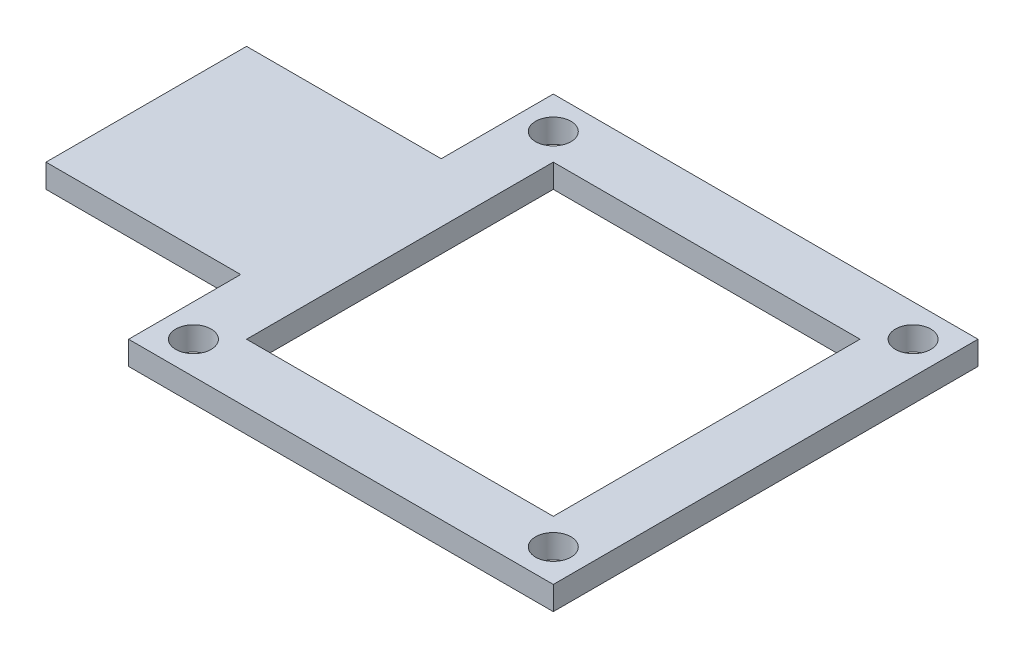
ISO-10303-21;
HEADER;
FILE_DESCRIPTION(('STEP AP214'),'2;1');
FILE_NAME('part.step','',(''),(''),'','','');
FILE_SCHEMA(('AUTOMOTIVE_DESIGN { 1 0 10303 214 1 1 1 1 }'));
ENDSEC;
DATA;
#1=APPLICATION_CONTEXT('core data for automotive mechanical design processes');
#2=APPLICATION_PROTOCOL_DEFINITION('international standard','automotive_design',2000,#1);
#3=PRODUCT_CONTEXT('',#1,'mechanical');
#4=PRODUCT('Part','Part','',(#3));
#5=PRODUCT_RELATED_PRODUCT_CATEGORY('part','',(#4));
#6=PRODUCT_DEFINITION_FORMATION('','',#4);
#7=PRODUCT_DEFINITION_CONTEXT('part definition',#1,'design');
#8=PRODUCT_DEFINITION('design','',#6,#7);
#9=PRODUCT_DEFINITION_SHAPE('','',#8);
#10=(LENGTH_UNIT() NAMED_UNIT(*) SI_UNIT(.MILLI.,.METRE.));
#11=(NAMED_UNIT(*) PLANE_ANGLE_UNIT() SI_UNIT($,.RADIAN.));
#12=(NAMED_UNIT(*) SI_UNIT($,.STERADIAN.) SOLID_ANGLE_UNIT());
#13=UNCERTAINTY_MEASURE_WITH_UNIT(LENGTH_MEASURE(1.E-05),#10,'distance_accuracy_value','');
#14=(GEOMETRIC_REPRESENTATION_CONTEXT(3) GLOBAL_UNCERTAINTY_ASSIGNED_CONTEXT((#13)) GLOBAL_UNIT_ASSIGNED_CONTEXT((#10,
#11,#12)) REPRESENTATION_CONTEXT('',''));
#15=CARTESIAN_POINT('',(0.,0.,0.));
#16=DIRECTION('',(0.,0.,1.));
#17=DIRECTION('',(1.,0.,0.));
#18=AXIS2_PLACEMENT_3D('',#15,#16,#17);
#19=CARTESIAN_POINT('',(-13.,2.,0.));
#20=DIRECTION('',(-1.,0.,0.));
#21=DIRECTION('',(0.,0.,1.));
#22=AXIS2_PLACEMENT_3D('',#19,#20,#21);
#23=PLANE('',#22);
#24=DIRECTION('',(0.,0.,-1.));
#25=VECTOR('',#24,1.);
#26=CARTESIAN_POINT('',(-13.,0.,0.));
#27=LINE('',#26,#25);
#28=CARTESIAN_POINT('',(-13.,0.,13.));
#29=VERTEX_POINT('',#28);
#30=CARTESIAN_POINT('',(-13.,0.,-13.));
#31=VERTEX_POINT('',#30);
#32=EDGE_CURVE('E189',#29,#31,#27,.T.);
#33=ORIENTED_EDGE('',*,*,#32,.T.);
#34=DIRECTION('',(0.,-1.,0.));
#35=VECTOR('',#34,1.);
#36=CARTESIAN_POINT('',(-13.,2.,-13.));
#37=LINE('',#36,#35);
#38=CARTESIAN_POINT('',(-13.,2.,-13.));
#39=VERTEX_POINT('',#38);
#40=EDGE_CURVE('E11',#39,#31,#37,.T.);
#41=ORIENTED_EDGE('',*,*,#40,.F.);
#42=DIRECTION('',(0.,0.,-1.));
#43=VECTOR('',#42,1.);
#44=CARTESIAN_POINT('',(-13.,2.,0.));
#45=LINE('',#44,#43);
#46=CARTESIAN_POINT('',(-13.,2.,13.));
#47=VERTEX_POINT('',#46);
#48=EDGE_CURVE('E139',#47,#39,#45,.T.);
#49=ORIENTED_EDGE('',*,*,#48,.F.);
#50=DIRECTION('',(0.,-1.,0.));
#51=VECTOR('',#50,1.);
#52=CARTESIAN_POINT('',(-13.,2.,13.));
#53=LINE('',#52,#51);
#54=EDGE_CURVE('E54',#47,#29,#53,.T.);
#55=ORIENTED_EDGE('',*,*,#54,.T.);
#56=EDGE_LOOP('',(#33,#41,#49,#55));
#57=FACE_BOUND('',#56,.T.);
#58=ADVANCED_FACE('F35',(#57),#23,.F.);
#59=CARTESIAN_POINT('',(0.,2.,-13.));
#60=DIRECTION('',(0.,0.,-1.));
#61=DIRECTION('',(-1.,0.,0.));
#62=AXIS2_PLACEMENT_3D('',#59,#60,#61);
#63=PLANE('',#62);
#64=DIRECTION('',(1.,0.,0.));
#65=VECTOR('',#64,1.);
#66=CARTESIAN_POINT('',(0.,0.,-13.));
#67=LINE('',#66,#65);
#68=CARTESIAN_POINT('',(13.,0.,-13.));
#69=VERTEX_POINT('',#68);
#70=EDGE_CURVE('E145',#31,#69,#67,.T.);
#71=ORIENTED_EDGE('',*,*,#70,.T.);
#72=DIRECTION('',(0.,-1.,0.));
#73=VECTOR('',#72,1.);
#74=CARTESIAN_POINT('',(13.,2.,-13.));
#75=LINE('',#74,#73);
#76=CARTESIAN_POINT('',(13.,2.,-13.));
#77=VERTEX_POINT('',#76);
#78=EDGE_CURVE('E45',#77,#69,#75,.T.);
#79=ORIENTED_EDGE('',*,*,#78,.F.);
#80=DIRECTION('',(1.,0.,0.));
#81=VECTOR('',#80,1.);
#82=CARTESIAN_POINT('',(0.,2.,-13.));
#83=LINE('',#82,#81);
#84=EDGE_CURVE('E132',#39,#77,#83,.T.);
#85=ORIENTED_EDGE('',*,*,#84,.F.);
#86=ORIENTED_EDGE('',*,*,#40,.T.);
#87=EDGE_LOOP('',(#71,#79,#85,#86));
#88=FACE_BOUND('',#87,.T.);
#89=ADVANCED_FACE('F144',(#88),#63,.F.);
#90=CARTESIAN_POINT('',(13.,2.,0.));
#91=DIRECTION('',(-1.,0.,0.));
#92=DIRECTION('',(0.,0.,1.));
#93=AXIS2_PLACEMENT_3D('',#90,#91,#92);
#94=PLANE('',#93);
#95=DIRECTION('',(0.,0.,-1.));
#96=VECTOR('',#95,1.);
#97=CARTESIAN_POINT('',(13.,0.,0.));
#98=LINE('',#97,#96);
#99=CARTESIAN_POINT('',(13.,0.,13.));
#100=VERTEX_POINT('',#99);
#101=EDGE_CURVE('E192',#100,#69,#98,.T.);
#102=ORIENTED_EDGE('',*,*,#101,.F.);
#103=DIRECTION('',(0.,-1.,0.));
#104=VECTOR('',#103,1.);
#105=CARTESIAN_POINT('',(13.,2.,13.));
#106=LINE('',#105,#104);
#107=CARTESIAN_POINT('',(13.,2.,13.));
#108=VERTEX_POINT('',#107);
#109=EDGE_CURVE('E92',#108,#100,#106,.T.);
#110=ORIENTED_EDGE('',*,*,#109,.F.);
#111=DIRECTION('',(0.,0.,-1.));
#112=VECTOR('',#111,1.);
#113=CARTESIAN_POINT('',(13.,2.,0.));
#114=LINE('',#113,#112);
#115=EDGE_CURVE('E138',#108,#77,#114,.T.);
#116=ORIENTED_EDGE('',*,*,#115,.T.);
#117=ORIENTED_EDGE('',*,*,#78,.T.);
#118=EDGE_LOOP('',(#102,#110,#116,#117));
#119=FACE_BOUND('',#118,.T.);
#120=ADVANCED_FACE('F149',(#119),#94,.T.);
#121=CARTESIAN_POINT('',(-18.,2.,0.));
#122=DIRECTION('',(-1.,0.,0.));
#123=DIRECTION('',(0.,0.,1.));
#124=AXIS2_PLACEMENT_3D('',#121,#122,#123);
#125=PLANE('',#124);
#126=DIRECTION('',(0.,0.,-1.));
#127=VECTOR('',#126,1.);
#128=CARTESIAN_POINT('',(-18.,0.,0.));
#129=LINE('',#128,#127);
#130=CARTESIAN_POINT('',(-18.,0.,-8.5));
#131=VERTEX_POINT('',#130);
#132=CARTESIAN_POINT('',(-18.,0.,-18.));
#133=VERTEX_POINT('',#132);
#134=EDGE_CURVE('E168',#131,#133,#129,.T.);
#135=ORIENTED_EDGE('',*,*,#134,.F.);
#136=DIRECTION('',(0.,-1.,0.));
#137=VECTOR('',#136,1.);
#138=CARTESIAN_POINT('',(-18.,2.,-8.5));
#139=LINE('',#138,#137);
#140=CARTESIAN_POINT('',(-18.,2.,-8.5));
#141=VERTEX_POINT('',#140);
#142=EDGE_CURVE('E39',#141,#131,#139,.T.);
#143=ORIENTED_EDGE('',*,*,#142,.F.);
#144=DIRECTION('',(0.,0.,-1.));
#145=VECTOR('',#144,1.);
#146=CARTESIAN_POINT('',(-18.,2.,0.));
#147=LINE('',#146,#145);
#148=CARTESIAN_POINT('',(-18.,2.,-18.));
#149=VERTEX_POINT('',#148);
#150=EDGE_CURVE('E209',#141,#149,#147,.T.);
#151=ORIENTED_EDGE('',*,*,#150,.T.);
#152=DIRECTION('',(0.,-1.,0.));
#153=VECTOR('',#152,1.);
#154=CARTESIAN_POINT('',(-18.,2.,-18.));
#155=LINE('',#154,#153);
#156=EDGE_CURVE('E167',#149,#133,#155,.T.);
#157=ORIENTED_EDGE('',*,*,#156,.T.);
#158=EDGE_LOOP('',(#135,#143,#151,#157));
#159=FACE_BOUND('',#158,.T.);
#160=ADVANCED_FACE('F236',(#159),#125,.T.);
#161=CARTESIAN_POINT('',(0.,2.,-8.5));
#162=DIRECTION('',(0.,0.,1.));
#163=DIRECTION('',(1.,0.,0.));
#164=AXIS2_PLACEMENT_3D('',#161,#162,#163);
#165=PLANE('',#164);
#166=DIRECTION('',(-1.,0.,0.));
#167=VECTOR('',#166,1.);
#168=CARTESIAN_POINT('',(0.,0.,-8.5));
#169=LINE('',#168,#167);
#170=CARTESIAN_POINT('',(-34.5,0.,-8.5));
#171=VERTEX_POINT('',#170);
#172=EDGE_CURVE('E171',#131,#171,#169,.T.);
#173=ORIENTED_EDGE('',*,*,#172,.T.);
#174=DIRECTION('',(0.,-1.,0.));
#175=VECTOR('',#174,1.);
#176=CARTESIAN_POINT('',(-34.5,2.,-8.5));
#177=LINE('',#176,#175);
#178=CARTESIAN_POINT('',(-34.5,2.,-8.5));
#179=VERTEX_POINT('',#178);
#180=EDGE_CURVE('E223',#179,#171,#177,.T.);
#181=ORIENTED_EDGE('',*,*,#180,.F.);
#182=DIRECTION('',(-1.,0.,0.));
#183=VECTOR('',#182,1.);
#184=CARTESIAN_POINT('',(0.,2.,-8.5));
#185=LINE('',#184,#183);
#186=EDGE_CURVE('E230',#141,#179,#185,.T.);
#187=ORIENTED_EDGE('',*,*,#186,.F.);
#188=ORIENTED_EDGE('',*,*,#142,.T.);
#189=EDGE_LOOP('',(#173,#181,#187,#188));
#190=FACE_BOUND('',#189,.T.);
#191=ADVANCED_FACE('F37',(#190),#165,.F.);
#192=CARTESIAN_POINT('',(-34.5,2.,0.));
#193=DIRECTION('',(-1.,0.,0.));
#194=DIRECTION('',(0.,0.,1.));
#195=AXIS2_PLACEMENT_3D('',#192,#193,#194);
#196=PLANE('',#195);
#197=DIRECTION('',(0.,0.,-1.));
#198=VECTOR('',#197,1.);
#199=CARTESIAN_POINT('',(-34.5,0.,0.));
#200=LINE('',#199,#198);
#201=CARTESIAN_POINT('',(-34.5,0.,8.5));
#202=VERTEX_POINT('',#201);
#203=EDGE_CURVE('E175',#202,#171,#200,.T.);
#204=ORIENTED_EDGE('',*,*,#203,.F.);
#205=DIRECTION('',(0.,-1.,0.));
#206=VECTOR('',#205,1.);
#207=CARTESIAN_POINT('',(-34.5,2.,8.5));
#208=LINE('',#207,#206);
#209=CARTESIAN_POINT('',(-34.5,2.,8.5));
#210=VERTEX_POINT('',#209);
#211=EDGE_CURVE('E222',#210,#202,#208,.T.);
#212=ORIENTED_EDGE('',*,*,#211,.F.);
#213=DIRECTION('',(0.,0.,-1.));
#214=VECTOR('',#213,1.);
#215=CARTESIAN_POINT('',(-34.5,2.,0.));
#216=LINE('',#215,#214);
#217=EDGE_CURVE('E325',#210,#179,#216,.T.);
#218=ORIENTED_EDGE('',*,*,#217,.T.);
#219=ORIENTED_EDGE('',*,*,#180,.T.);
#220=EDGE_LOOP('',(#204,#212,#218,#219));
#221=FACE_BOUND('',#220,.T.);
#222=ADVANCED_FACE('F268',(#221),#196,.T.);
#223=CARTESIAN_POINT('',(0.,2.,8.5));
#224=DIRECTION('',(0.,0.,1.));
#225=DIRECTION('',(1.,0.,0.));
#226=AXIS2_PLACEMENT_3D('',#223,#224,#225);
#227=PLANE('',#226);
#228=DIRECTION('',(-1.,0.,0.));
#229=VECTOR('',#228,1.);
#230=CARTESIAN_POINT('',(0.,0.,8.5));
#231=LINE('',#230,#229);
#232=CARTESIAN_POINT('',(-18.,0.,8.5));
#233=VERTEX_POINT('',#232);
#234=EDGE_CURVE('E178',#233,#202,#231,.T.);
#235=ORIENTED_EDGE('',*,*,#234,.F.);
#236=DIRECTION('',(0.,-1.,0.));
#237=VECTOR('',#236,1.);
#238=CARTESIAN_POINT('',(-18.,2.,8.5));
#239=LINE('',#238,#237);
#240=CARTESIAN_POINT('',(-18.,2.,8.5));
#241=VERTEX_POINT('',#240);
#242=EDGE_CURVE('E220',#241,#233,#239,.T.);
#243=ORIENTED_EDGE('',*,*,#242,.F.);
#244=DIRECTION('',(-1.,0.,0.));
#245=VECTOR('',#244,1.);
#246=CARTESIAN_POINT('',(0.,2.,8.5));
#247=LINE('',#246,#245);
#248=EDGE_CURVE('E266',#241,#210,#247,.T.);
#249=ORIENTED_EDGE('',*,*,#248,.T.);
#250=ORIENTED_EDGE('',*,*,#211,.T.);
#251=EDGE_LOOP('',(#235,#243,#249,#250));
#252=FACE_BOUND('',#251,.T.);
#253=ADVANCED_FACE('F263',(#252),#227,.T.);
#254=CARTESIAN_POINT('',(-18.,0.,18.));
#255=VERTEX_POINT('',#254);
#256=EDGE_CURVE('E172',#255,#233,#129,.T.);
#257=ORIENTED_EDGE('',*,*,#256,.F.);
#258=DIRECTION('',(0.,-1.,0.));
#259=VECTOR('',#258,1.);
#260=CARTESIAN_POINT('',(-18.,2.,18.));
#261=LINE('',#260,#259);
#262=CARTESIAN_POINT('',(-18.,2.,18.));
#263=VERTEX_POINT('',#262);
#264=EDGE_CURVE('E218',#263,#255,#261,.T.);
#265=ORIENTED_EDGE('',*,*,#264,.F.);
#266=EDGE_CURVE('E260',#263,#241,#147,.T.);
#267=ORIENTED_EDGE('',*,*,#266,.T.);
#268=ORIENTED_EDGE('',*,*,#242,.T.);
#269=EDGE_LOOP('',(#257,#265,#267,#268));
#270=FACE_BOUND('',#269,.T.);
#271=ADVANCED_FACE('F259',(#270),#125,.T.);
#272=CARTESIAN_POINT('',(0.,2.,18.));
#273=DIRECTION('',(0.,0.,-1.));
#274=DIRECTION('',(-1.,0.,0.));
#275=AXIS2_PLACEMENT_3D('',#272,#273,#274);
#276=PLANE('',#275);
#277=DIRECTION('',(1.,0.,0.));
#278=VECTOR('',#277,1.);
#279=CARTESIAN_POINT('',(0.,0.,18.));
#280=LINE('',#279,#278);
#281=CARTESIAN_POINT('',(18.,0.,18.));
#282=VERTEX_POINT('',#281);
#283=EDGE_CURVE('E181',#255,#282,#280,.T.);
#284=ORIENTED_EDGE('',*,*,#283,.T.);
#285=DIRECTION('',(0.,-1.,0.));
#286=VECTOR('',#285,1.);
#287=CARTESIAN_POINT('',(18.,2.,18.));
#288=LINE('',#287,#286);
#289=CARTESIAN_POINT('',(18.,2.,18.));
#290=VERTEX_POINT('',#289);
#291=EDGE_CURVE('E215',#290,#282,#288,.T.);
#292=ORIENTED_EDGE('',*,*,#291,.F.);
#293=DIRECTION('',(1.,0.,0.));
#294=VECTOR('',#293,1.);
#295=CARTESIAN_POINT('',(0.,2.,18.));
#296=LINE('',#295,#294);
#297=EDGE_CURVE('E255',#263,#290,#296,.T.);
#298=ORIENTED_EDGE('',*,*,#297,.F.);
#299=ORIENTED_EDGE('',*,*,#264,.T.);
#300=EDGE_LOOP('',(#284,#292,#298,#299));
#301=FACE_BOUND('',#300,.T.);
#302=ADVANCED_FACE('F254',(#301),#276,.F.);
#303=CARTESIAN_POINT('',(18.,2.,0.));
#304=DIRECTION('',(-1.,0.,0.));
#305=DIRECTION('',(0.,0.,1.));
#306=AXIS2_PLACEMENT_3D('',#303,#304,#305);
#307=PLANE('',#306);
#308=DIRECTION('',(0.,0.,-1.));
#309=VECTOR('',#308,1.);
#310=CARTESIAN_POINT('',(18.,0.,0.));
#311=LINE('',#310,#309);
#312=CARTESIAN_POINT('',(18.,0.,-18.));
#313=VERTEX_POINT('',#312);
#314=EDGE_CURVE('E183',#282,#313,#311,.T.);
#315=ORIENTED_EDGE('',*,*,#314,.T.);
#316=DIRECTION('',(0.,-1.,0.));
#317=VECTOR('',#316,1.);
#318=CARTESIAN_POINT('',(18.,2.,-18.));
#319=LINE('',#318,#317);
#320=CARTESIAN_POINT('',(18.,2.,-18.));
#321=VERTEX_POINT('',#320);
#322=EDGE_CURVE('E213',#321,#313,#319,.T.);
#323=ORIENTED_EDGE('',*,*,#322,.F.);
#324=DIRECTION('',(0.,0.,-1.));
#325=VECTOR('',#324,1.);
#326=CARTESIAN_POINT('',(18.,2.,0.));
#327=LINE('',#326,#325);
#328=EDGE_CURVE('E251',#290,#321,#327,.T.);
#329=ORIENTED_EDGE('',*,*,#328,.F.);
#330=ORIENTED_EDGE('',*,*,#291,.T.);
#331=EDGE_LOOP('',(#315,#323,#329,#330));
#332=FACE_BOUND('',#331,.T.);
#333=ADVANCED_FACE('F248',(#332),#307,.F.);
#334=CARTESIAN_POINT('',(15.25,2.,15.25));
#335=DIRECTION('',(0.,-1.,0.));
#336=DIRECTION('',(0.,0.,-1.));
#337=AXIS2_PLACEMENT_3D('',#334,#335,#336);
#338=CYLINDRICAL_SURFACE('',#337,1.5);
#339=CARTESIAN_POINT('',(15.25,2.,15.25));
#340=DIRECTION('',(0.,1.,0.));
#341=DIRECTION('',(0.,0.,1.));
#342=AXIS2_PLACEMENT_3D('',#339,#340,#341);
#343=CIRCLE('',#342,1.5);
#344=CARTESIAN_POINT('',(15.25,2.,16.75));
#345=VERTEX_POINT('',#344);
#346=EDGE_CURVE('E161',#345,#345,#343,.T.);
#347=ORIENTED_EDGE('',*,*,#346,.T.);
#348=EDGE_LOOP('',(#347));
#349=FACE_BOUND('',#348,.T.);
#350=CARTESIAN_POINT('',(15.25,0.,15.25));
#351=DIRECTION('',(0.,1.,0.));
#352=DIRECTION('',(0.,0.,1.));
#353=AXIS2_PLACEMENT_3D('',#350,#351,#352);
#354=CIRCLE('',#353,1.5);
#355=CARTESIAN_POINT('',(15.25,0.,16.75));
#356=VERTEX_POINT('',#355);
#357=EDGE_CURVE('E203',#356,#356,#354,.T.);
#358=ORIENTED_EDGE('',*,*,#357,.F.);
#359=EDGE_LOOP('',(#358));
#360=FACE_BOUND('',#359,.T.);
#361=ADVANCED_FACE('F289',(#349,#360),#338,.F.);
#362=CARTESIAN_POINT('',(-15.25,2.,-15.25));
#363=DIRECTION('',(0.,-1.,0.));
#364=DIRECTION('',(0.,0.,-1.));
#365=AXIS2_PLACEMENT_3D('',#362,#363,#364);
#366=CYLINDRICAL_SURFACE('',#365,1.5);
#367=CARTESIAN_POINT('',(-15.25,2.,-15.25));
#368=DIRECTION('',(0.,1.,0.));
#369=DIRECTION('',(0.,0.,1.));
#370=AXIS2_PLACEMENT_3D('',#367,#368,#369);
#371=CIRCLE('',#370,1.5);
#372=CARTESIAN_POINT('',(-15.25,2.,-13.75));
#373=VERTEX_POINT('',#372);
#374=EDGE_CURVE('E158',#373,#373,#371,.T.);
#375=ORIENTED_EDGE('',*,*,#374,.T.);
#376=EDGE_LOOP('',(#375));
#377=FACE_BOUND('',#376,.T.);
#378=CARTESIAN_POINT('',(-15.25,0.,-15.25));
#379=DIRECTION('',(0.,1.,0.));
#380=DIRECTION('',(0.,0.,1.));
#381=AXIS2_PLACEMENT_3D('',#378,#379,#380);
#382=CIRCLE('',#381,1.5);
#383=CARTESIAN_POINT('',(-15.25,0.,-13.75));
#384=VERTEX_POINT('',#383);
#385=EDGE_CURVE('E200',#384,#384,#382,.T.);
#386=ORIENTED_EDGE('',*,*,#385,.F.);
#387=EDGE_LOOP('',(#386));
#388=FACE_BOUND('',#387,.T.);
#389=ADVANCED_FACE('F307',(#377,#388),#366,.F.);
#390=CARTESIAN_POINT('',(-15.25,2.,15.25));
#391=DIRECTION('',(0.,-1.,0.));
#392=DIRECTION('',(0.,0.,-1.));
#393=AXIS2_PLACEMENT_3D('',#390,#391,#392);
#394=CYLINDRICAL_SURFACE('',#393,1.5);
#395=CARTESIAN_POINT('',(-15.25,2.,15.25));
#396=DIRECTION('',(0.,1.,0.));
#397=DIRECTION('',(0.,0.,1.));
#398=AXIS2_PLACEMENT_3D('',#395,#396,#397);
#399=CIRCLE('',#398,1.5);
#400=CARTESIAN_POINT('',(-15.25,2.,16.75));
#401=VERTEX_POINT('',#400);
#402=EDGE_CURVE('E152',#401,#401,#399,.F.);
#403=ORIENTED_EDGE('',*,*,#402,.F.);
#404=EDGE_LOOP('',(#403));
#405=FACE_BOUND('',#404,.T.);
#406=CARTESIAN_POINT('',(-15.25,0.,15.25));
#407=DIRECTION('',(0.,1.,0.));
#408=DIRECTION('',(0.,0.,1.));
#409=AXIS2_PLACEMENT_3D('',#406,#407,#408);
#410=CIRCLE('',#409,1.5);
#411=CARTESIAN_POINT('',(-15.25,0.,16.75));
#412=VERTEX_POINT('',#411);
#413=EDGE_CURVE('E197',#412,#412,#410,.F.);
#414=ORIENTED_EDGE('',*,*,#413,.T.);
#415=EDGE_LOOP('',(#414));
#416=FACE_BOUND('',#415,.T.);
#417=ADVANCED_FACE('F304',(#405,#416),#394,.F.);
#418=CARTESIAN_POINT('',(0.,2.,13.));
#419=DIRECTION('',(0.,0.,-1.));
#420=DIRECTION('',(-1.,0.,0.));
#421=AXIS2_PLACEMENT_3D('',#418,#419,#420);
#422=PLANE('',#421);
#423=DIRECTION('',(1.,0.,0.));
#424=VECTOR('',#423,1.);
#425=CARTESIAN_POINT('',(0.,0.,13.));
#426=LINE('',#425,#424);
#427=EDGE_CURVE('E194',#29,#100,#426,.T.);
#428=ORIENTED_EDGE('',*,*,#427,.F.);
#429=ORIENTED_EDGE('',*,*,#54,.F.);
#430=DIRECTION('',(1.,0.,0.));
#431=VECTOR('',#430,1.);
#432=CARTESIAN_POINT('',(0.,2.,13.));
#433=LINE('',#432,#431);
#434=EDGE_CURVE('E150',#47,#108,#433,.T.);
#435=ORIENTED_EDGE('',*,*,#434,.T.);
#436=ORIENTED_EDGE('',*,*,#109,.T.);
#437=EDGE_LOOP('',(#428,#429,#435,#436));
#438=FACE_BOUND('',#437,.T.);
#439=ADVANCED_FACE('F286',(#438),#422,.T.);
#440=CARTESIAN_POINT('',(0.,2.,-18.));
#441=DIRECTION('',(0.,0.,-1.));
#442=DIRECTION('',(-1.,0.,0.));
#443=AXIS2_PLACEMENT_3D('',#440,#441,#442);
#444=PLANE('',#443);
#445=DIRECTION('',(1.,0.,0.));
#446=VECTOR('',#445,1.);
#447=CARTESIAN_POINT('',(0.,0.,-18.));
#448=LINE('',#447,#446);
#449=EDGE_CURVE('E186',#133,#313,#448,.T.);
#450=ORIENTED_EDGE('',*,*,#449,.F.);
#451=ORIENTED_EDGE('',*,*,#156,.F.);
#452=DIRECTION('',(1.,0.,0.));
#453=VECTOR('',#452,1.);
#454=CARTESIAN_POINT('',(0.,2.,-18.));
#455=LINE('',#454,#453);
#456=EDGE_CURVE('E241',#149,#321,#455,.T.);
#457=ORIENTED_EDGE('',*,*,#456,.T.);
#458=ORIENTED_EDGE('',*,*,#322,.T.);
#459=EDGE_LOOP('',(#450,#451,#457,#458));
#460=FACE_BOUND('',#459,.T.);
#461=ADVANCED_FACE('F240',(#460),#444,.T.);
#462=CARTESIAN_POINT('',(15.25,2.,-15.25));
#463=DIRECTION('',(0.,-1.,0.));
#464=DIRECTION('',(0.,0.,-1.));
#465=AXIS2_PLACEMENT_3D('',#462,#463,#464);
#466=CYLINDRICAL_SURFACE('',#465,1.5);
#467=CARTESIAN_POINT('',(15.25,2.,-15.25));
#468=DIRECTION('',(0.,1.,0.));
#469=DIRECTION('',(0.,0.,1.));
#470=AXIS2_PLACEMENT_3D('',#467,#468,#469);
#471=CIRCLE('',#470,1.5);
#472=CARTESIAN_POINT('',(15.25,2.,-13.75));
#473=VERTEX_POINT('',#472);
#474=EDGE_CURVE('E164',#473,#473,#471,.F.);
#475=ORIENTED_EDGE('',*,*,#474,.F.);
#476=EDGE_LOOP('',(#475));
#477=FACE_BOUND('',#476,.T.);
#478=CARTESIAN_POINT('',(15.25,0.,-15.25));
#479=DIRECTION('',(0.,1.,0.));
#480=DIRECTION('',(0.,0.,1.));
#481=AXIS2_PLACEMENT_3D('',#478,#479,#480);
#482=CIRCLE('',#481,1.5);
#483=CARTESIAN_POINT('',(15.25,0.,-13.75));
#484=VERTEX_POINT('',#483);
#485=EDGE_CURVE('E206',#484,#484,#482,.F.);
#486=ORIENTED_EDGE('',*,*,#485,.T.);
#487=EDGE_LOOP('',(#486));
#488=FACE_BOUND('',#487,.T.);
#489=ADVANCED_FACE('F285',(#477,#488),#466,.F.);
#490=CARTESIAN_POINT('',(0.,2.,0.));
#491=DIRECTION('',(0.,1.,0.));
#492=DIRECTION('',(0.,0.,1.));
#493=AXIS2_PLACEMENT_3D('',#490,#491,#492);
#494=PLANE('',#493);
#495=ORIENTED_EDGE('',*,*,#150,.F.);
#496=ORIENTED_EDGE('',*,*,#186,.T.);
#497=ORIENTED_EDGE('',*,*,#217,.F.);
#498=ORIENTED_EDGE('',*,*,#248,.F.);
#499=ORIENTED_EDGE('',*,*,#266,.F.);
#500=ORIENTED_EDGE('',*,*,#297,.T.);
#501=ORIENTED_EDGE('',*,*,#328,.T.);
#502=ORIENTED_EDGE('',*,*,#456,.F.);
#503=EDGE_LOOP('',(#495,#496,#497,#498,#499,#500,#501,#502));
#504=FACE_BOUND('',#503,.T.);
#505=ORIENTED_EDGE('',*,*,#48,.T.);
#506=ORIENTED_EDGE('',*,*,#84,.T.);
#507=ORIENTED_EDGE('',*,*,#115,.F.);
#508=ORIENTED_EDGE('',*,*,#434,.F.);
#509=EDGE_LOOP('',(#505,#506,#507,#508));
#510=FACE_BOUND('',#509,.T.);
#511=ORIENTED_EDGE('',*,*,#402,.T.);
#512=EDGE_LOOP('',(#511));
#513=FACE_BOUND('',#512,.T.);
#514=ORIENTED_EDGE('',*,*,#374,.F.);
#515=EDGE_LOOP('',(#514));
#516=FACE_BOUND('',#515,.T.);
#517=ORIENTED_EDGE('',*,*,#346,.F.);
#518=EDGE_LOOP('',(#517));
#519=FACE_BOUND('',#518,.T.);
#520=ORIENTED_EDGE('',*,*,#474,.T.);
#521=EDGE_LOOP('',(#520));
#522=FACE_BOUND('',#521,.T.);
#523=ADVANCED_FACE('F134',(#504,#510,#513,#516,#519,#522),#494,.T.);
#524=CARTESIAN_POINT('',(0.,0.,0.));
#525=DIRECTION('',(0.,1.,0.));
#526=DIRECTION('',(0.,0.,1.));
#527=AXIS2_PLACEMENT_3D('',#524,#525,#526);
#528=PLANE('',#527);
#529=ORIENTED_EDGE('',*,*,#134,.T.);
#530=ORIENTED_EDGE('',*,*,#449,.T.);
#531=ORIENTED_EDGE('',*,*,#314,.F.);
#532=ORIENTED_EDGE('',*,*,#283,.F.);
#533=ORIENTED_EDGE('',*,*,#256,.T.);
#534=ORIENTED_EDGE('',*,*,#234,.T.);
#535=ORIENTED_EDGE('',*,*,#203,.T.);
#536=ORIENTED_EDGE('',*,*,#172,.F.);
#537=EDGE_LOOP('',(#529,#530,#531,#532,#533,#534,#535,#536));
#538=FACE_BOUND('',#537,.T.);
#539=ORIENTED_EDGE('',*,*,#32,.F.);
#540=ORIENTED_EDGE('',*,*,#427,.T.);
#541=ORIENTED_EDGE('',*,*,#101,.T.);
#542=ORIENTED_EDGE('',*,*,#70,.F.);
#543=EDGE_LOOP('',(#539,#540,#541,#542));
#544=FACE_BOUND('',#543,.T.);
#545=ORIENTED_EDGE('',*,*,#413,.F.);
#546=EDGE_LOOP('',(#545));
#547=FACE_BOUND('',#546,.T.);
#548=ORIENTED_EDGE('',*,*,#385,.T.);
#549=EDGE_LOOP('',(#548));
#550=FACE_BOUND('',#549,.T.);
#551=ORIENTED_EDGE('',*,*,#357,.T.);
#552=EDGE_LOOP('',(#551));
#553=FACE_BOUND('',#552,.T.);
#554=ORIENTED_EDGE('',*,*,#485,.F.);
#555=EDGE_LOOP('',(#554));
#556=FACE_BOUND('',#555,.T.);
#557=ADVANCED_FACE('F233',(#538,#544,#547,#550,#553,#556),#528,.F.);
#558=CLOSED_SHELL('',(#58,#89,#120,#160,#191,#222,#253,#271,#302,#333,#361,#389,#417,#439,#461,
#489,#523,#557));
#559=MANIFOLD_SOLID_BREP('B2',#558);
#560=ADVANCED_BREP_SHAPE_REPRESENTATION('',(#18,#559),#14);
#561=SHAPE_DEFINITION_REPRESENTATION(#9,#560);
ENDSEC;
END-ISO-10303-21;
